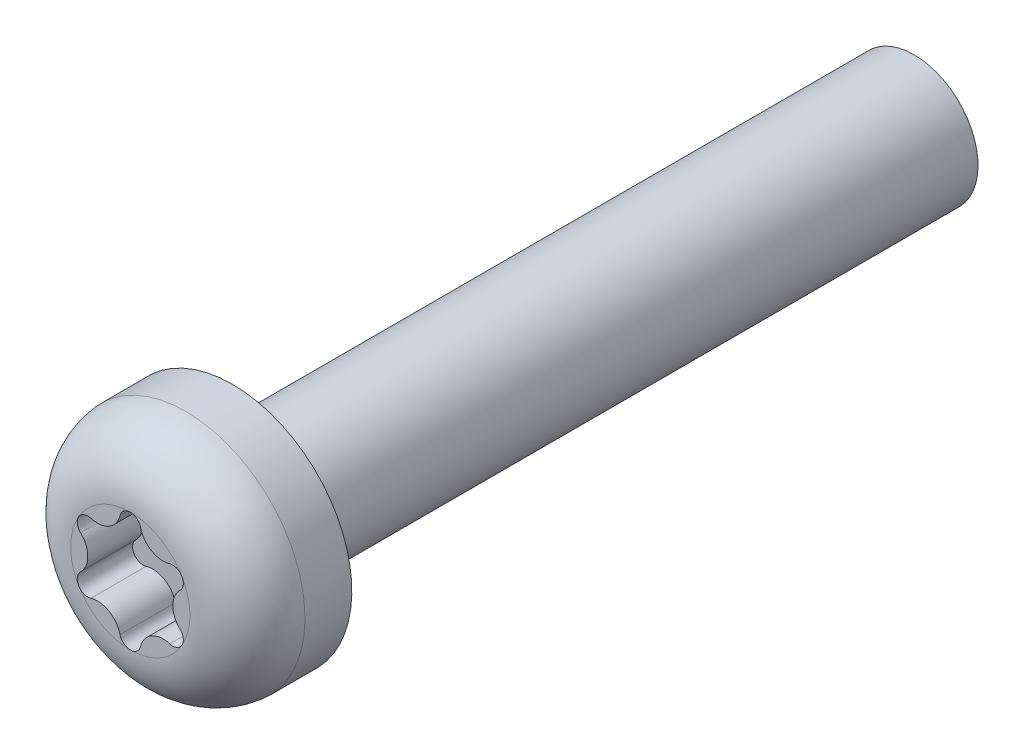
ISO-10303-21;
HEADER;
FILE_DESCRIPTION(('STEP AP214'),'2;1');
FILE_NAME('part.step','',(''),(''),'','','');
FILE_SCHEMA(('AUTOMOTIVE_DESIGN { 1 0 10303 214 1 1 1 1 }'));
ENDSEC;
DATA;
#1=APPLICATION_CONTEXT('core data for automotive mechanical design processes');
#2=APPLICATION_PROTOCOL_DEFINITION('international standard','automotive_design',2000,#1);
#3=PRODUCT_CONTEXT('',#1,'mechanical');
#4=PRODUCT('Part','Part','',(#3));
#5=PRODUCT_RELATED_PRODUCT_CATEGORY('part','',(#4));
#6=PRODUCT_DEFINITION_FORMATION('','',#4);
#7=PRODUCT_DEFINITION_CONTEXT('part definition',#1,'design');
#8=PRODUCT_DEFINITION('design','',#6,#7);
#9=PRODUCT_DEFINITION_SHAPE('','',#8);
#10=(LENGTH_UNIT() NAMED_UNIT(*) SI_UNIT(.MILLI.,.METRE.));
#11=(NAMED_UNIT(*) PLANE_ANGLE_UNIT() SI_UNIT($,.RADIAN.));
#12=(NAMED_UNIT(*) SI_UNIT($,.STERADIAN.) SOLID_ANGLE_UNIT());
#13=UNCERTAINTY_MEASURE_WITH_UNIT(LENGTH_MEASURE(1.E-05),#10,'distance_accuracy_value','');
#14=(GEOMETRIC_REPRESENTATION_CONTEXT(3) GLOBAL_UNCERTAINTY_ASSIGNED_CONTEXT((#13)) GLOBAL_UNIT_ASSIGNED_CONTEXT((#10,
#11,#12)) REPRESENTATION_CONTEXT('',''));
#15=CARTESIAN_POINT('',(0.,0.,0.));
#16=DIRECTION('',(0.,0.,1.));
#17=DIRECTION('',(1.,0.,0.));
#18=AXIS2_PLACEMENT_3D('',#15,#16,#17);
#19=CARTESIAN_POINT('',(0.,0.,2.4));
#20=DIRECTION('',(0.,0.,1.));
#21=DIRECTION('',(0.,-1.,0.));
#22=AXIS2_PLACEMENT_3D('',#19,#20,#21);
#23=PLANE('',#22);
#24=CARTESIAN_POINT('',(0.998035801344209,0.576216238566964,2.4));
#25=DIRECTION('',(0.,0.,1.));
#26=DIRECTION('',(-1.,0.,0.));
#27=AXIS2_PLACEMENT_3D('',#24,#25,#26);
#28=CIRCLE('',#27,0.24756752286608);
#29=CARTESIAN_POINT('',(1.16844714996964,0.396634361313971,2.4));
#30=VERTEX_POINT('',#29);
#31=CARTESIAN_POINT('',(1.21243556529822,0.700000000000004,2.4));
#32=VERTEX_POINT('',#31);
#33=EDGE_CURVE('E223',#30,#32,#28,.T.);
#34=ORIENTED_EDGE('',*,*,#33,.F.);
#35=CARTESIAN_POINT('',(1.54482697992028,0.,2.4));
#36=DIRECTION('',(0.,0.,-1.));
#37=DIRECTION('',(1.,0.,0.));
#38=AXIS2_PLACEMENT_3D('',#35,#36,#37);
#39=CIRCLE('',#38,0.546791178576075);
#40=CARTESIAN_POINT('',(1.16844714996965,-0.396634361313966,2.4));
#41=VERTEX_POINT('',#40);
#42=EDGE_CURVE('E219',#41,#30,#39,.T.);
#43=ORIENTED_EDGE('',*,*,#42,.F.);
#44=CARTESIAN_POINT('',(0.998035801344216,-0.576216238566959,2.4));
#45=DIRECTION('',(0.,0.,1.));
#46=DIRECTION('',(-1.,0.,0.));
#47=AXIS2_PLACEMENT_3D('',#44,#45,#46);
#48=CIRCLE('',#47,0.24756752286608);
#49=CARTESIAN_POINT('',(1.21243556529823,-0.699999999999997,2.4));
#50=VERTEX_POINT('',#49);
#51=EDGE_CURVE('E216',#50,#41,#48,.T.);
#52=ORIENTED_EDGE('',*,*,#51,.F.);
#53=CARTESIAN_POINT('',(0.,0.,2.4));
#54=DIRECTION('',(0.,0.,-1.));
#55=DIRECTION('',(0.,1.,0.));
#56=AXIS2_PLACEMENT_3D('',#53,#54,#55);
#57=CIRCLE('',#56,1.4);
#58=EDGE_CURVE('E45',#32,#50,#57,.T.);
#59=ORIENTED_EDGE('',*,*,#58,.F.);
#60=EDGE_LOOP('',(#34,#43,#52,#59));
#61=FACE_BOUND('',#60,.T.);
#62=ADVANCED_FACE('F37',(#61),#23,.T.);
#63=CARTESIAN_POINT('',(0.927719007896534,0.813587734196249,2.4));
#64=VERTEX_POINT('',#63);
#65=EDGE_CURVE('E222',#32,#64,#28,.T.);
#66=ORIENTED_EDGE('',*,*,#65,.F.);
#67=CARTESIAN_POINT('',(0.,1.4,2.4));
#68=VERTEX_POINT('',#67);
#69=EDGE_CURVE('E11',#68,#32,#57,.T.);
#70=ORIENTED_EDGE('',*,*,#69,.F.);
#71=CARTESIAN_POINT('',(0.,1.15243247713392,2.4));
#72=DIRECTION('',(0.,0.,1.));
#73=DIRECTION('',(-1.,0.,0.));
#74=AXIS2_PLACEMENT_3D('',#71,#72,#73);
#75=CIRCLE('',#74,0.247567522866081);
#76=CARTESIAN_POINT('',(0.240728142073107,1.21022209551021,2.4));
#77=VERTEX_POINT('',#76);
#78=EDGE_CURVE('E61',#77,#68,#75,.T.);
#79=ORIENTED_EDGE('',*,*,#78,.F.);
#80=CARTESIAN_POINT('',(0.772413489960139,1.33785940906255,2.4));
#81=DIRECTION('',(0.,0.,-1.));
#82=DIRECTION('',(1.,0.,0.));
#83=AXIS2_PLACEMENT_3D('',#80,#81,#82);
#84=CIRCLE('',#83,0.546791178576075);
#85=EDGE_CURVE('E225',#64,#77,#84,.T.);
#86=ORIENTED_EDGE('',*,*,#85,.F.);
#87=EDGE_LOOP('',(#66,#70,#79,#86));
#88=FACE_BOUND('',#87,.T.);
#89=ADVANCED_FACE('F311',(#88),#23,.T.);
#90=CARTESIAN_POINT('',(0.92771900789654,-0.813587734196244,2.4));
#91=VERTEX_POINT('',#90);
#92=EDGE_CURVE('E217',#91,#50,#48,.T.);
#93=ORIENTED_EDGE('',*,*,#92,.F.);
#94=CARTESIAN_POINT('',(0.772413489960152,-1.33785940906255,2.4));
#95=DIRECTION('',(0.,0.,-1.));
#96=DIRECTION('',(1.,0.,0.));
#97=AXIS2_PLACEMENT_3D('',#94,#95,#96);
#98=CIRCLE('',#97,0.546791178576075);
#99=CARTESIAN_POINT('',(0.240728142073118,-1.21022209551022,2.4));
#100=VERTEX_POINT('',#99);
#101=EDGE_CURVE('E213',#100,#91,#98,.T.);
#102=ORIENTED_EDGE('',*,*,#101,.F.);
#103=CARTESIAN_POINT('',(0.,-1.15243247713393,2.4));
#104=DIRECTION('',(0.,0.,1.));
#105=DIRECTION('',(-1.,0.,0.));
#106=AXIS2_PLACEMENT_3D('',#103,#104,#105);
#107=CIRCLE('',#106,0.24756752286608);
#108=CARTESIAN_POINT('',(0.,-1.40000000000001,2.4));
#109=VERTEX_POINT('',#108);
#110=EDGE_CURVE('E210',#109,#100,#107,.T.);
#111=ORIENTED_EDGE('',*,*,#110,.F.);
#112=EDGE_CURVE('E274',#50,#109,#57,.T.);
#113=ORIENTED_EDGE('',*,*,#112,.F.);
#114=EDGE_LOOP('',(#93,#102,#111,#113));
#115=FACE_BOUND('',#114,.T.);
#116=ADVANCED_FACE('F290',(#115),#23,.T.);
#117=CARTESIAN_POINT('',(-0.240728142073107,1.21022209551021,2.4));
#118=VERTEX_POINT('',#117);
#119=EDGE_CURVE('E170',#68,#118,#75,.T.);
#120=ORIENTED_EDGE('',*,*,#119,.F.);
#121=CARTESIAN_POINT('',(-1.21243556529822,0.699999999999993,2.4));
#122=VERTEX_POINT('',#121);
#123=EDGE_CURVE('E46',#122,#68,#57,.T.);
#124=ORIENTED_EDGE('',*,*,#123,.F.);
#125=CARTESIAN_POINT('',(-0.998035801344203,0.576216238566952,2.4));
#126=DIRECTION('',(0.,0.,1.));
#127=DIRECTION('',(-1.,0.,0.));
#128=AXIS2_PLACEMENT_3D('',#125,#126,#127);
#129=CIRCLE('',#128,0.24756752286608);
#130=CARTESIAN_POINT('',(-0.927719007896527,0.813587734196238,2.4));
#131=VERTEX_POINT('',#130);
#132=EDGE_CURVE('E53',#131,#122,#129,.T.);
#133=ORIENTED_EDGE('',*,*,#132,.F.);
#134=CARTESIAN_POINT('',(-0.772413489960141,1.33785940906255,2.4));
#135=DIRECTION('',(0.,0.,-1.));
#136=DIRECTION('',(1.,0.,0.));
#137=AXIS2_PLACEMENT_3D('',#134,#135,#136);
#138=CIRCLE('',#137,0.546791178576075);
#139=EDGE_CURVE('E153',#118,#131,#138,.T.);
#140=ORIENTED_EDGE('',*,*,#139,.F.);
#141=EDGE_LOOP('',(#120,#124,#133,#140));
#142=FACE_BOUND('',#141,.T.);
#143=ADVANCED_FACE('F303',(#142),#23,.T.);
#144=CARTESIAN_POINT('',(-0.240728142073093,-1.21022209551022,2.4));
#145=VERTEX_POINT('',#144);
#146=EDGE_CURVE('E211',#145,#109,#107,.T.);
#147=ORIENTED_EDGE('',*,*,#146,.F.);
#148=CARTESIAN_POINT('',(-0.772413489960126,-1.33785940906256,2.4));
#149=DIRECTION('',(0.,0.,-1.));
#150=DIRECTION('',(1.,0.,0.));
#151=AXIS2_PLACEMENT_3D('',#148,#149,#150);
#152=CIRCLE('',#151,0.546791178576075);
#153=CARTESIAN_POINT('',(-0.927719007896521,-0.813587734196255,2.4));
#154=VERTEX_POINT('',#153);
#155=EDGE_CURVE('E207',#154,#145,#152,.T.);
#156=ORIENTED_EDGE('',*,*,#155,.F.);
#157=CARTESIAN_POINT('',(-0.998035801344196,-0.57621623856697,2.4));
#158=DIRECTION('',(0.,0.,1.));
#159=DIRECTION('',(-1.,0.,0.));
#160=AXIS2_PLACEMENT_3D('',#157,#158,#159);
#161=CIRCLE('',#160,0.24756752286608);
#162=CARTESIAN_POINT('',(-1.2124355652982,-0.700000000000013,2.4));
#163=VERTEX_POINT('',#162);
#164=EDGE_CURVE('E204',#163,#154,#161,.T.);
#165=ORIENTED_EDGE('',*,*,#164,.F.);
#166=EDGE_CURVE('E271',#109,#163,#57,.T.);
#167=ORIENTED_EDGE('',*,*,#166,.F.);
#168=EDGE_LOOP('',(#147,#156,#165,#167));
#169=FACE_BOUND('',#168,.T.);
#170=ADVANCED_FACE('F296',(#169),#23,.T.);
#171=CARTESIAN_POINT('',(-1.16844714996963,-0.396634361313977,2.4));
#172=VERTEX_POINT('',#171);
#173=EDGE_CURVE('E205',#172,#163,#161,.T.);
#174=ORIENTED_EDGE('',*,*,#173,.F.);
#175=CARTESIAN_POINT('',(-1.54482697992027,0.,2.4));
#176=DIRECTION('',(0.,0.,-1.));
#177=DIRECTION('',(1.,0.,0.));
#178=AXIS2_PLACEMENT_3D('',#175,#176,#177);
#179=CIRCLE('',#178,0.546791178576075);
#180=CARTESIAN_POINT('',(-1.16844714996963,0.39663436131396,2.4));
#181=VERTEX_POINT('',#180);
#182=EDGE_CURVE('E201',#181,#172,#179,.T.);
#183=ORIENTED_EDGE('',*,*,#182,.F.);
#184=EDGE_CURVE('E199',#122,#181,#129,.T.);
#185=ORIENTED_EDGE('',*,*,#184,.F.);
#186=EDGE_CURVE('E266',#163,#122,#57,.T.);
#187=ORIENTED_EDGE('',*,*,#186,.F.);
#188=EDGE_LOOP('',(#174,#183,#185,#187));
#189=FACE_BOUND('',#188,.T.);
#190=ADVANCED_FACE('F39',(#189),#23,.T.);
#191=CARTESIAN_POINT('',(0.,0.,0.996153846153846));
#192=DIRECTION('',(0.,0.,-1.));
#193=DIRECTION('',(0.,1.,0.));
#194=AXIS2_PLACEMENT_3D('',#191,#192,#193);
#195=DEGENERATE_TOROIDAL_SURFACE('',#194,1.4,1.40384615384615,.T.);
#196=ORIENTED_EDGE('',*,*,#69,.T.);
#197=ORIENTED_EDGE('',*,*,#58,.T.);
#198=ORIENTED_EDGE('',*,*,#112,.T.);
#199=ORIENTED_EDGE('',*,*,#166,.T.);
#200=ORIENTED_EDGE('',*,*,#186,.T.);
#201=ORIENTED_EDGE('',*,*,#123,.T.);
#202=EDGE_LOOP('',(#196,#197,#198,#199,#200,#201));
#203=FACE_BOUND('',#202,.T.);
#204=CARTESIAN_POINT('',(0.,0.,1.1));
#205=DIRECTION('',(0.,0.,-1.));
#206=DIRECTION('',(0.,1.,0.));
#207=AXIS2_PLACEMENT_3D('',#204,#205,#206);
#208=CIRCLE('',#207,2.8);
#209=CARTESIAN_POINT('',(0.,2.8,1.1));
#210=VERTEX_POINT('',#209);
#211=EDGE_CURVE('E261',#210,#210,#208,.T.);
#212=ORIENTED_EDGE('',*,*,#211,.F.);
#213=EDGE_LOOP('',(#212));
#214=FACE_BOUND('',#213,.T.);
#215=ADVANCED_FACE('F280',(#203,#214),#195,.T.);
#216=CARTESIAN_POINT('',(0.,0.,2.4));
#217=DIRECTION('',(0.,0.,-1.));
#218=DIRECTION('',(0.,1.,0.));
#219=AXIS2_PLACEMENT_3D('',#216,#217,#218);
#220=CYLINDRICAL_SURFACE('',#219,2.8);
#221=ORIENTED_EDGE('',*,*,#211,.T.);
#222=EDGE_LOOP('',(#221));
#223=FACE_BOUND('',#222,.T.);
#224=CARTESIAN_POINT('',(0.,0.,0.));
#225=DIRECTION('',(0.,0.,-1.));
#226=DIRECTION('',(0.,1.,0.));
#227=AXIS2_PLACEMENT_3D('',#224,#225,#226);
#228=CIRCLE('',#227,2.8);
#229=CARTESIAN_POINT('',(0.,2.8,0.));
#230=VERTEX_POINT('',#229);
#231=EDGE_CURVE('E259',#230,#230,#228,.T.);
#232=ORIENTED_EDGE('',*,*,#231,.F.);
#233=EDGE_LOOP('',(#232));
#234=FACE_BOUND('',#233,.T.);
#235=ADVANCED_FACE('F349',(#223,#234),#220,.T.);
#236=CARTESIAN_POINT('',(0.,2.8,0.));
#237=DIRECTION('',(0.,0.,-1.));
#238=DIRECTION('',(0.,1.,0.));
#239=AXIS2_PLACEMENT_3D('',#236,#237,#238);
#240=PLANE('',#239);
#241=ORIENTED_EDGE('',*,*,#231,.T.);
#242=EDGE_LOOP('',(#241));
#243=FACE_BOUND('',#242,.T.);
#244=CARTESIAN_POINT('',(0.,0.,0.));
#245=DIRECTION('',(0.,0.,-1.));
#246=DIRECTION('',(0.,1.,0.));
#247=AXIS2_PLACEMENT_3D('',#244,#245,#246);
#248=CIRCLE('',#247,1.5);
#249=CARTESIAN_POINT('',(0.,1.5,0.));
#250=VERTEX_POINT('',#249);
#251=EDGE_CURVE('E256',#250,#250,#248,.T.);
#252=ORIENTED_EDGE('',*,*,#251,.F.);
#253=EDGE_LOOP('',(#252));
#254=FACE_BOUND('',#253,.T.);
#255=ADVANCED_FACE('F390',(#243,#254),#240,.T.);
#256=CARTESIAN_POINT('',(0.,0.,2.4));
#257=DIRECTION('',(0.,0.,-1.));
#258=DIRECTION('',(0.,1.,0.));
#259=AXIS2_PLACEMENT_3D('',#256,#257,#258);
#260=CYLINDRICAL_SURFACE('',#259,1.5);
#261=ORIENTED_EDGE('',*,*,#251,.T.);
#262=EDGE_LOOP('',(#261));
#263=FACE_BOUND('',#262,.T.);
#264=CARTESIAN_POINT('',(0.,0.,-16.));
#265=DIRECTION('',(0.,0.,-1.));
#266=DIRECTION('',(0.,1.,0.));
#267=AXIS2_PLACEMENT_3D('',#264,#265,#266);
#268=CIRCLE('',#267,1.5);
#269=CARTESIAN_POINT('',(0.,1.5,-16.));
#270=VERTEX_POINT('',#269);
#271=EDGE_CURVE('E230',#270,#270,#268,.T.);
#272=ORIENTED_EDGE('',*,*,#271,.F.);
#273=EDGE_LOOP('',(#272));
#274=FACE_BOUND('',#273,.T.);
#275=ADVANCED_FACE('F377',(#263,#274),#260,.T.);
#276=CARTESIAN_POINT('',(0.,1.5,-16.));
#277=DIRECTION('',(0.,0.,-1.));
#278=DIRECTION('',(0.,1.,0.));
#279=AXIS2_PLACEMENT_3D('',#276,#277,#278);
#280=PLANE('',#279);
#281=ORIENTED_EDGE('',*,*,#271,.T.);
#282=EDGE_LOOP('',(#281));
#283=FACE_BOUND('',#282,.T.);
#284=ADVANCED_FACE('F372',(#283),#280,.T.);
#285=CARTESIAN_POINT('',(-0.772413489960141,1.33785940906255,1.1));
#286=DIRECTION('',(0.,0.,1.));
#287=DIRECTION('',(1.,0.,0.));
#288=AXIS2_PLACEMENT_3D('',#285,#286,#287);
#289=CYLINDRICAL_SURFACE('',#288,0.546791178576075);
#290=ORIENTED_EDGE('',*,*,#139,.T.);
#291=DIRECTION('',(0.,0.,1.));
#292=VECTOR('',#291,1.);
#293=CARTESIAN_POINT('',(-0.927719007896527,0.813587734196238,1.1));
#294=LINE('',#293,#292);
#295=CARTESIAN_POINT('',(-0.927719007896527,0.813587734196238,1.1));
#296=VERTEX_POINT('',#295);
#297=EDGE_CURVE('E145',#296,#131,#294,.T.);
#298=ORIENTED_EDGE('',*,*,#297,.F.);
#299=CARTESIAN_POINT('',(-0.772413489960141,1.33785940906255,1.1));
#300=DIRECTION('',(0.,0.,-1.));
#301=DIRECTION('',(1.,0.,0.));
#302=AXIS2_PLACEMENT_3D('',#299,#300,#301);
#303=CIRCLE('',#302,0.546791178576075);
#304=CARTESIAN_POINT('',(-0.240728142073107,1.21022209551021,1.1));
#305=VERTEX_POINT('',#304);
#306=EDGE_CURVE('E150',#305,#296,#303,.T.);
#307=ORIENTED_EDGE('',*,*,#306,.F.);
#308=DIRECTION('',(0.,0.,1.));
#309=VECTOR('',#308,1.);
#310=CARTESIAN_POINT('',(-0.240728142073107,1.21022209551021,1.1));
#311=LINE('',#310,#309);
#312=EDGE_CURVE('E228',#305,#118,#311,.T.);
#313=ORIENTED_EDGE('',*,*,#312,.T.);
#314=EDGE_LOOP('',(#290,#298,#307,#313));
#315=FACE_BOUND('',#314,.T.);
#316=ADVANCED_FACE('F147',(#315),#289,.T.);
#317=CARTESIAN_POINT('',(0.,1.15243247713392,1.1));
#318=DIRECTION('',(0.,0.,1.));
#319=DIRECTION('',(1.,0.,0.));
#320=AXIS2_PLACEMENT_3D('',#317,#318,#319);
#321=CYLINDRICAL_SURFACE('',#320,0.247567522866081);
#322=ORIENTED_EDGE('',*,*,#78,.T.);
#323=ORIENTED_EDGE('',*,*,#119,.T.);
#324=ORIENTED_EDGE('',*,*,#312,.F.);
#325=CARTESIAN_POINT('',(0.,1.15243247713392,1.1));
#326=DIRECTION('',(0.,0.,1.));
#327=DIRECTION('',(-1.,0.,0.));
#328=AXIS2_PLACEMENT_3D('',#325,#326,#327);
#329=CIRCLE('',#328,0.247567522866081);
#330=CARTESIAN_POINT('',(0.240728142073107,1.21022209551021,1.1));
#331=VERTEX_POINT('',#330);
#332=EDGE_CURVE('E155',#331,#305,#329,.T.);
#333=ORIENTED_EDGE('',*,*,#332,.F.);
#334=DIRECTION('',(0.,0.,1.));
#335=VECTOR('',#334,1.);
#336=CARTESIAN_POINT('',(0.240728142073107,1.21022209551021,1.1));
#337=LINE('',#336,#335);
#338=EDGE_CURVE('E231',#331,#77,#337,.T.);
#339=ORIENTED_EDGE('',*,*,#338,.T.);
#340=EDGE_LOOP('',(#322,#323,#324,#333,#339));
#341=FACE_BOUND('',#340,.T.);
#342=ADVANCED_FACE('F304',(#341),#321,.F.);
#343=CARTESIAN_POINT('',(0.772413489960139,1.33785940906255,1.1));
#344=DIRECTION('',(0.,0.,1.));
#345=DIRECTION('',(1.,0.,0.));
#346=AXIS2_PLACEMENT_3D('',#343,#344,#345);
#347=CYLINDRICAL_SURFACE('',#346,0.546791178576075);
#348=ORIENTED_EDGE('',*,*,#85,.T.);
#349=ORIENTED_EDGE('',*,*,#338,.F.);
#350=CARTESIAN_POINT('',(0.772413489960139,1.33785940906255,1.1));
#351=DIRECTION('',(0.,0.,-1.));
#352=DIRECTION('',(1.,0.,0.));
#353=AXIS2_PLACEMENT_3D('',#350,#351,#352);
#354=CIRCLE('',#353,0.546791178576075);
#355=CARTESIAN_POINT('',(0.927719007896534,0.813587734196249,1.1));
#356=VERTEX_POINT('',#355);
#357=EDGE_CURVE('E195',#356,#331,#354,.T.);
#358=ORIENTED_EDGE('',*,*,#357,.F.);
#359=DIRECTION('',(0.,0.,1.));
#360=VECTOR('',#359,1.);
#361=CARTESIAN_POINT('',(0.927719007896534,0.813587734196249,1.1));
#362=LINE('',#361,#360);
#363=EDGE_CURVE('E233',#356,#64,#362,.T.);
#364=ORIENTED_EDGE('',*,*,#363,.T.);
#365=EDGE_LOOP('',(#348,#349,#358,#364));
#366=FACE_BOUND('',#365,.T.);
#367=ADVANCED_FACE('F308',(#366),#347,.T.);
#368=CARTESIAN_POINT('',(0.998035801344209,0.576216238566964,1.1));
#369=DIRECTION('',(0.,0.,1.));
#370=DIRECTION('',(1.,0.,0.));
#371=AXIS2_PLACEMENT_3D('',#368,#369,#370);
#372=CYLINDRICAL_SURFACE('',#371,0.24756752286608);
#373=ORIENTED_EDGE('',*,*,#33,.T.);
#374=ORIENTED_EDGE('',*,*,#65,.T.);
#375=ORIENTED_EDGE('',*,*,#363,.F.);
#376=CARTESIAN_POINT('',(0.998035801344209,0.576216238566964,1.1));
#377=DIRECTION('',(0.,0.,1.));
#378=DIRECTION('',(-1.,0.,0.));
#379=AXIS2_PLACEMENT_3D('',#376,#377,#378);
#380=CIRCLE('',#379,0.24756752286608);
#381=CARTESIAN_POINT('',(1.16844714996964,0.396634361313971,1.1));
#382=VERTEX_POINT('',#381);
#383=EDGE_CURVE('E192',#382,#356,#380,.T.);
#384=ORIENTED_EDGE('',*,*,#383,.F.);
#385=DIRECTION('',(0.,0.,1.));
#386=VECTOR('',#385,1.);
#387=CARTESIAN_POINT('',(1.16844714996964,0.396634361313971,1.1));
#388=LINE('',#387,#386);
#389=EDGE_CURVE('E236',#382,#30,#388,.T.);
#390=ORIENTED_EDGE('',*,*,#389,.T.);
#391=EDGE_LOOP('',(#373,#374,#375,#384,#390));
#392=FACE_BOUND('',#391,.T.);
#393=ADVANCED_FACE('F313',(#392),#372,.F.);
#394=CARTESIAN_POINT('',(1.54482697992028,0.,1.1));
#395=DIRECTION('',(0.,0.,1.));
#396=DIRECTION('',(1.,0.,0.));
#397=AXIS2_PLACEMENT_3D('',#394,#395,#396);
#398=CYLINDRICAL_SURFACE('',#397,0.546791178576075);
#399=ORIENTED_EDGE('',*,*,#42,.T.);
#400=ORIENTED_EDGE('',*,*,#389,.F.);
#401=CARTESIAN_POINT('',(1.54482697992028,0.,1.1));
#402=DIRECTION('',(0.,0.,-1.));
#403=DIRECTION('',(1.,0.,0.));
#404=AXIS2_PLACEMENT_3D('',#401,#402,#403);
#405=CIRCLE('',#404,0.546791178576075);
#406=CARTESIAN_POINT('',(1.16844714996965,-0.396634361313966,1.1));
#407=VERTEX_POINT('',#406);
#408=EDGE_CURVE('E189',#407,#382,#405,.T.);
#409=ORIENTED_EDGE('',*,*,#408,.F.);
#410=DIRECTION('',(0.,0.,1.));
#411=VECTOR('',#410,1.);
#412=CARTESIAN_POINT('',(1.16844714996965,-0.396634361313966,1.1));
#413=LINE('',#412,#411);
#414=EDGE_CURVE('E238',#407,#41,#413,.T.);
#415=ORIENTED_EDGE('',*,*,#414,.T.);
#416=EDGE_LOOP('',(#399,#400,#409,#415));
#417=FACE_BOUND('',#416,.T.);
#418=ADVANCED_FACE('F317',(#417),#398,.T.);
#419=CARTESIAN_POINT('',(0.998035801344216,-0.576216238566959,1.1));
#420=DIRECTION('',(0.,0.,1.));
#421=DIRECTION('',(1.,0.,0.));
#422=AXIS2_PLACEMENT_3D('',#419,#420,#421);
#423=CYLINDRICAL_SURFACE('',#422,0.24756752286608);
#424=ORIENTED_EDGE('',*,*,#92,.T.);
#425=ORIENTED_EDGE('',*,*,#51,.T.);
#426=ORIENTED_EDGE('',*,*,#414,.F.);
#427=CARTESIAN_POINT('',(0.998035801344216,-0.576216238566959,1.1));
#428=DIRECTION('',(0.,0.,1.));
#429=DIRECTION('',(-1.,0.,0.));
#430=AXIS2_PLACEMENT_3D('',#427,#428,#429);
#431=CIRCLE('',#430,0.24756752286608);
#432=CARTESIAN_POINT('',(0.92771900789654,-0.813587734196244,1.1));
#433=VERTEX_POINT('',#432);
#434=EDGE_CURVE('E186',#433,#407,#431,.T.);
#435=ORIENTED_EDGE('',*,*,#434,.F.);
#436=DIRECTION('',(0.,0.,1.));
#437=VECTOR('',#436,1.);
#438=CARTESIAN_POINT('',(0.92771900789654,-0.813587734196244,1.1));
#439=LINE('',#438,#437);
#440=EDGE_CURVE('E241',#433,#91,#439,.T.);
#441=ORIENTED_EDGE('',*,*,#440,.T.);
#442=EDGE_LOOP('',(#424,#425,#426,#435,#441));
#443=FACE_BOUND('',#442,.T.);
#444=ADVANCED_FACE('F319',(#443),#423,.F.);
#445=CARTESIAN_POINT('',(0.772413489960152,-1.33785940906255,1.1));
#446=DIRECTION('',(0.,0.,1.));
#447=DIRECTION('',(1.,0.,0.));
#448=AXIS2_PLACEMENT_3D('',#445,#446,#447);
#449=CYLINDRICAL_SURFACE('',#448,0.546791178576075);
#450=ORIENTED_EDGE('',*,*,#101,.T.);
#451=ORIENTED_EDGE('',*,*,#440,.F.);
#452=CARTESIAN_POINT('',(0.772413489960152,-1.33785940906255,1.1));
#453=DIRECTION('',(0.,0.,-1.));
#454=DIRECTION('',(1.,0.,0.));
#455=AXIS2_PLACEMENT_3D('',#452,#453,#454);
#456=CIRCLE('',#455,0.546791178576075);
#457=CARTESIAN_POINT('',(0.240728142073118,-1.21022209551022,1.1));
#458=VERTEX_POINT('',#457);
#459=EDGE_CURVE('E183',#458,#433,#456,.T.);
#460=ORIENTED_EDGE('',*,*,#459,.F.);
#461=DIRECTION('',(0.,0.,1.));
#462=VECTOR('',#461,1.);
#463=CARTESIAN_POINT('',(0.240728142073118,-1.21022209551022,1.1));
#464=LINE('',#463,#462);
#465=EDGE_CURVE('E243',#458,#100,#464,.T.);
#466=ORIENTED_EDGE('',*,*,#465,.T.);
#467=EDGE_LOOP('',(#450,#451,#460,#466));
#468=FACE_BOUND('',#467,.T.);
#469=ADVANCED_FACE('F323',(#468),#449,.T.);
#470=CARTESIAN_POINT('',(0.,-1.15243247713393,1.1));
#471=DIRECTION('',(0.,0.,1.));
#472=DIRECTION('',(1.,0.,0.));
#473=AXIS2_PLACEMENT_3D('',#470,#471,#472);
#474=CYLINDRICAL_SURFACE('',#473,0.24756752286608);
#475=ORIENTED_EDGE('',*,*,#146,.T.);
#476=ORIENTED_EDGE('',*,*,#110,.T.);
#477=ORIENTED_EDGE('',*,*,#465,.F.);
#478=CARTESIAN_POINT('',(0.,-1.15243247713393,1.1));
#479=DIRECTION('',(0.,0.,1.));
#480=DIRECTION('',(-1.,0.,0.));
#481=AXIS2_PLACEMENT_3D('',#478,#479,#480);
#482=CIRCLE('',#481,0.24756752286608);
#483=CARTESIAN_POINT('',(-0.240728142073093,-1.21022209551022,1.1));
#484=VERTEX_POINT('',#483);
#485=EDGE_CURVE('E180',#484,#458,#482,.T.);
#486=ORIENTED_EDGE('',*,*,#485,.F.);
#487=DIRECTION('',(0.,0.,1.));
#488=VECTOR('',#487,1.);
#489=CARTESIAN_POINT('',(-0.240728142073093,-1.21022209551022,1.1));
#490=LINE('',#489,#488);
#491=EDGE_CURVE('E246',#484,#145,#490,.T.);
#492=ORIENTED_EDGE('',*,*,#491,.T.);
#493=EDGE_LOOP('',(#475,#476,#477,#486,#492));
#494=FACE_BOUND('',#493,.T.);
#495=ADVANCED_FACE('F324',(#494),#474,.F.);
#496=CARTESIAN_POINT('',(-0.772413489960126,-1.33785940906256,1.1));
#497=DIRECTION('',(0.,0.,1.));
#498=DIRECTION('',(1.,0.,0.));
#499=AXIS2_PLACEMENT_3D('',#496,#497,#498);
#500=CYLINDRICAL_SURFACE('',#499,0.546791178576075);
#501=ORIENTED_EDGE('',*,*,#155,.T.);
#502=ORIENTED_EDGE('',*,*,#491,.F.);
#503=CARTESIAN_POINT('',(-0.772413489960126,-1.33785940906256,1.1));
#504=DIRECTION('',(0.,0.,-1.));
#505=DIRECTION('',(1.,0.,0.));
#506=AXIS2_PLACEMENT_3D('',#503,#504,#505);
#507=CIRCLE('',#506,0.546791178576075);
#508=CARTESIAN_POINT('',(-0.927719007896521,-0.813587734196255,1.1));
#509=VERTEX_POINT('',#508);
#510=EDGE_CURVE('E177',#509,#484,#507,.T.);
#511=ORIENTED_EDGE('',*,*,#510,.F.);
#512=DIRECTION('',(0.,0.,1.));
#513=VECTOR('',#512,1.);
#514=CARTESIAN_POINT('',(-0.927719007896521,-0.813587734196255,1.1));
#515=LINE('',#514,#513);
#516=EDGE_CURVE('E248',#509,#154,#515,.T.);
#517=ORIENTED_EDGE('',*,*,#516,.T.);
#518=EDGE_LOOP('',(#501,#502,#511,#517));
#519=FACE_BOUND('',#518,.T.);
#520=ADVANCED_FACE('F328',(#519),#500,.T.);
#521=CARTESIAN_POINT('',(-0.998035801344196,-0.57621623856697,1.1));
#522=DIRECTION('',(0.,0.,1.));
#523=DIRECTION('',(1.,0.,0.));
#524=AXIS2_PLACEMENT_3D('',#521,#522,#523);
#525=CYLINDRICAL_SURFACE('',#524,0.24756752286608);
#526=ORIENTED_EDGE('',*,*,#173,.T.);
#527=ORIENTED_EDGE('',*,*,#164,.T.);
#528=ORIENTED_EDGE('',*,*,#516,.F.);
#529=CARTESIAN_POINT('',(-0.998035801344196,-0.57621623856697,1.1));
#530=DIRECTION('',(0.,0.,1.));
#531=DIRECTION('',(-1.,0.,0.));
#532=AXIS2_PLACEMENT_3D('',#529,#530,#531);
#533=CIRCLE('',#532,0.24756752286608);
#534=CARTESIAN_POINT('',(-1.16844714996963,-0.396634361313977,1.1));
#535=VERTEX_POINT('',#534);
#536=EDGE_CURVE('E174',#535,#509,#533,.T.);
#537=ORIENTED_EDGE('',*,*,#536,.F.);
#538=DIRECTION('',(0.,0.,1.));
#539=VECTOR('',#538,1.);
#540=CARTESIAN_POINT('',(-1.16844714996963,-0.396634361313977,1.1));
#541=LINE('',#540,#539);
#542=EDGE_CURVE('E251',#535,#172,#541,.T.);
#543=ORIENTED_EDGE('',*,*,#542,.T.);
#544=EDGE_LOOP('',(#526,#527,#528,#537,#543));
#545=FACE_BOUND('',#544,.T.);
#546=ADVANCED_FACE('F329',(#545),#525,.F.);
#547=CARTESIAN_POINT('',(-1.54482697992027,0.,1.1));
#548=DIRECTION('',(0.,0.,1.));
#549=DIRECTION('',(1.,0.,0.));
#550=AXIS2_PLACEMENT_3D('',#547,#548,#549);
#551=CYLINDRICAL_SURFACE('',#550,0.546791178576075);
#552=ORIENTED_EDGE('',*,*,#182,.T.);
#553=ORIENTED_EDGE('',*,*,#542,.F.);
#554=CARTESIAN_POINT('',(-1.54482697992027,0.,1.1));
#555=DIRECTION('',(0.,0.,-1.));
#556=DIRECTION('',(1.,0.,0.));
#557=AXIS2_PLACEMENT_3D('',#554,#555,#556);
#558=CIRCLE('',#557,0.546791178576075);
#559=CARTESIAN_POINT('',(-1.16844714996963,0.39663436131396,1.1));
#560=VERTEX_POINT('',#559);
#561=EDGE_CURVE('E164',#560,#535,#558,.T.);
#562=ORIENTED_EDGE('',*,*,#561,.F.);
#563=DIRECTION('',(0.,0.,1.));
#564=VECTOR('',#563,1.);
#565=CARTESIAN_POINT('',(-1.16844714996963,0.39663436131396,1.1));
#566=LINE('',#565,#564);
#567=EDGE_CURVE('E154',#560,#181,#566,.T.);
#568=ORIENTED_EDGE('',*,*,#567,.T.);
#569=EDGE_LOOP('',(#552,#553,#562,#568));
#570=FACE_BOUND('',#569,.T.);
#571=ADVANCED_FACE('F331',(#570),#551,.T.);
#572=CARTESIAN_POINT('',(-0.998035801344203,0.576216238566952,1.1));
#573=DIRECTION('',(0.,0.,1.));
#574=DIRECTION('',(1.,0.,0.));
#575=AXIS2_PLACEMENT_3D('',#572,#573,#574);
#576=CYLINDRICAL_SURFACE('',#575,0.24756752286608);
#577=ORIENTED_EDGE('',*,*,#132,.T.);
#578=ORIENTED_EDGE('',*,*,#184,.T.);
#579=ORIENTED_EDGE('',*,*,#567,.F.);
#580=CARTESIAN_POINT('',(-0.998035801344203,0.576216238566952,1.1));
#581=DIRECTION('',(0.,0.,1.));
#582=DIRECTION('',(-1.,0.,0.));
#583=AXIS2_PLACEMENT_3D('',#580,#581,#582);
#584=CIRCLE('',#583,0.24756752286608);
#585=EDGE_CURVE('E158',#296,#560,#584,.T.);
#586=ORIENTED_EDGE('',*,*,#585,.F.);
#587=ORIENTED_EDGE('',*,*,#297,.T.);
#588=EDGE_LOOP('',(#577,#578,#579,#586,#587));
#589=FACE_BOUND('',#588,.T.);
#590=ADVANCED_FACE('F159',(#589),#576,.F.);
#591=CARTESIAN_POINT('',(-0.386206744980071,1.24514594309823,1.1));
#592=DIRECTION('',(0.,0.,1.));
#593=DIRECTION('',(1.,0.,0.));
#594=AXIS2_PLACEMENT_3D('',#591,#592,#593);
#595=PLANE('',#594);
#596=ORIENTED_EDGE('',*,*,#306,.T.);
#597=ORIENTED_EDGE('',*,*,#585,.T.);
#598=ORIENTED_EDGE('',*,*,#561,.T.);
#599=ORIENTED_EDGE('',*,*,#536,.T.);
#600=ORIENTED_EDGE('',*,*,#510,.T.);
#601=ORIENTED_EDGE('',*,*,#485,.T.);
#602=ORIENTED_EDGE('',*,*,#459,.T.);
#603=ORIENTED_EDGE('',*,*,#434,.T.);
#604=ORIENTED_EDGE('',*,*,#408,.T.);
#605=ORIENTED_EDGE('',*,*,#383,.T.);
#606=ORIENTED_EDGE('',*,*,#357,.T.);
#607=ORIENTED_EDGE('',*,*,#332,.T.);
#608=EDGE_LOOP('',(#596,#597,#598,#599,#600,#601,#602,#603,#604,#605,#606,#607));
#609=FACE_BOUND('',#608,.T.);
#610=ADVANCED_FACE('F166',(#609),#595,.T.);
#611=CLOSED_SHELL('',(#62,#89,#116,#143,#170,#190,#215,#235,#255,#275,#284,#316,#342,#367,#393,
#418,#444,#469,#495,#520,#546,#571,#590,#610));
#612=MANIFOLD_SOLID_BREP('B2',#611);
#613=ADVANCED_BREP_SHAPE_REPRESENTATION('',(#18,#612),#14);
#614=SHAPE_DEFINITION_REPRESENTATION(#9,#613);
ENDSEC;
END-ISO-10303-21;
